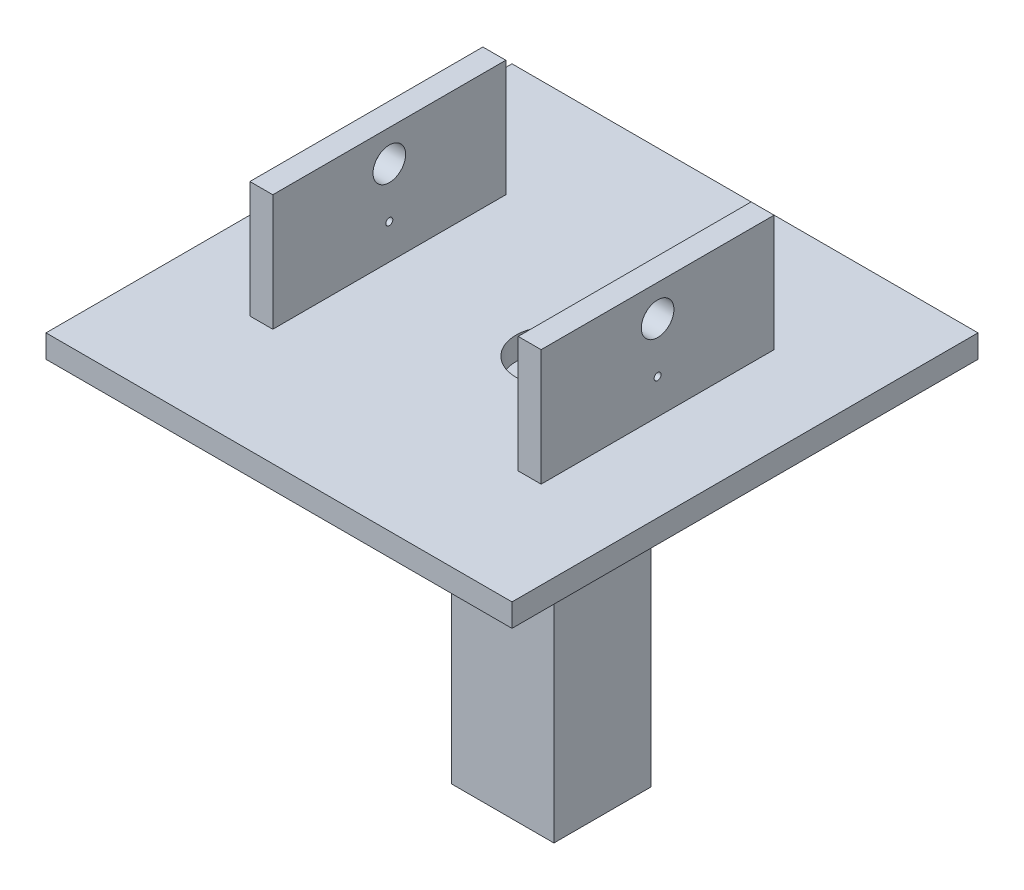
ISO-10303-21;
HEADER;
FILE_DESCRIPTION(('STEP AP214'),'2;1');
FILE_NAME('part.step','',(''),(''),'','','');
FILE_SCHEMA(('AUTOMOTIVE_DESIGN { 1 0 10303 214 1 1 1 1 }'));
ENDSEC;
DATA;
#1=APPLICATION_CONTEXT('core data for automotive mechanical design processes');
#2=APPLICATION_PROTOCOL_DEFINITION('international standard','automotive_design',2000,#1);
#3=PRODUCT_CONTEXT('',#1,'mechanical');
#4=PRODUCT('Part','Part','',(#3));
#5=PRODUCT_RELATED_PRODUCT_CATEGORY('part','',(#4));
#6=PRODUCT_DEFINITION_FORMATION('','',#4);
#7=PRODUCT_DEFINITION_CONTEXT('part definition',#1,'design');
#8=PRODUCT_DEFINITION('design','',#6,#7);
#9=PRODUCT_DEFINITION_SHAPE('','',#8);
#10=(LENGTH_UNIT() NAMED_UNIT(*) SI_UNIT(.MILLI.,.METRE.));
#11=(NAMED_UNIT(*) PLANE_ANGLE_UNIT() SI_UNIT($,.RADIAN.));
#12=(NAMED_UNIT(*) SI_UNIT($,.STERADIAN.) SOLID_ANGLE_UNIT());
#13=UNCERTAINTY_MEASURE_WITH_UNIT(LENGTH_MEASURE(1.E-05),#10,'distance_accuracy_value','');
#14=(GEOMETRIC_REPRESENTATION_CONTEXT(3) GLOBAL_UNCERTAINTY_ASSIGNED_CONTEXT((#13)) GLOBAL_UNIT_ASSIGNED_CONTEXT((#10,
#11,#12)) REPRESENTATION_CONTEXT('',''));
#15=CARTESIAN_POINT('',(0.,0.,0.));
#16=DIRECTION('',(0.,0.,1.));
#17=DIRECTION('',(1.,0.,0.));
#18=AXIS2_PLACEMENT_3D('',#15,#16,#17);
#19=CARTESIAN_POINT('',(0.,0.,0.));
#20=DIRECTION('',(0.,1.,0.));
#21=DIRECTION('',(0.,0.,1.));
#22=AXIS2_PLACEMENT_3D('',#19,#20,#21);
#23=PLANE('',#22);
#24=DIRECTION('',(0.,0.,1.));
#25=VECTOR('',#24,1.);
#26=CARTESIAN_POINT('',(0.,0.,0.));
#27=LINE('',#26,#25);
#28=CARTESIAN_POINT('',(0.,0.,0.));
#29=VERTEX_POINT('',#28);
#30=CARTESIAN_POINT('',(0.,0.,101.6));
#31=VERTEX_POINT('',#30);
#32=EDGE_CURVE('E308',#29,#31,#27,.T.);
#33=ORIENTED_EDGE('',*,*,#32,.F.);
#34=DIRECTION('',(-1.,0.,0.));
#35=VECTOR('',#34,1.);
#36=CARTESIAN_POINT('',(0.,0.,0.));
#37=LINE('',#36,#35);
#38=CARTESIAN_POINT('',(101.6,0.,0.));
#39=VERTEX_POINT('',#38);
#40=EDGE_CURVE('E314',#39,#29,#37,.T.);
#41=ORIENTED_EDGE('',*,*,#40,.F.);
#42=DIRECTION('',(0.,0.,-1.));
#43=VECTOR('',#42,1.);
#44=CARTESIAN_POINT('',(101.6,0.,0.));
#45=LINE('',#44,#43);
#46=CARTESIAN_POINT('',(101.6,0.,101.6));
#47=VERTEX_POINT('',#46);
#48=EDGE_CURVE('E330',#47,#39,#45,.T.);
#49=ORIENTED_EDGE('',*,*,#48,.F.);
#50=DIRECTION('',(1.,0.,0.));
#51=VECTOR('',#50,1.);
#52=CARTESIAN_POINT('',(0.,0.,101.6));
#53=LINE('',#52,#51);
#54=EDGE_CURVE('E327',#31,#47,#53,.T.);
#55=ORIENTED_EDGE('',*,*,#54,.F.);
#56=EDGE_LOOP('',(#33,#41,#49,#55));
#57=FACE_BOUND('',#56,.T.);
#58=DIRECTION('',(0.,0.,-1.));
#59=VECTOR('',#58,1.);
#60=CARTESIAN_POINT('',(48.1494249392775,0.,61.3607169010717));
#61=LINE('',#60,#59);
#62=CARTESIAN_POINT('',(48.1494249392775,0.,61.3607169010717));
#63=VERTEX_POINT('',#62);
#64=CARTESIAN_POINT('',(48.1494249392775,0.,40.1623354641884));
#65=VERTEX_POINT('',#64);
#66=EDGE_CURVE('E182',#63,#65,#61,.T.);
#67=ORIENTED_EDGE('',*,*,#66,.F.);
#68=DIRECTION('',(-1.,0.,0.));
#69=VECTOR('',#68,1.);
#70=CARTESIAN_POINT('',(48.1494249392775,0.,61.3607169010717));
#71=LINE('',#70,#69);
#72=CARTESIAN_POINT('',(70.4998923238175,0.,61.3607169010717));
#73=VERTEX_POINT('',#72);
#74=EDGE_CURVE('E179',#73,#63,#71,.T.);
#75=ORIENTED_EDGE('',*,*,#74,.F.);
#76=DIRECTION('',(0.,0.,1.));
#77=VECTOR('',#76,1.);
#78=CARTESIAN_POINT('',(70.4998923238175,0.,61.3607169010717));
#79=LINE('',#78,#77);
#80=CARTESIAN_POINT('',(70.4998923238175,0.,40.1623354641884));
#81=VERTEX_POINT('',#80);
#82=EDGE_CURVE('E67',#81,#73,#79,.T.);
#83=ORIENTED_EDGE('',*,*,#82,.F.);
#84=DIRECTION('',(1.,0.,0.));
#85=VECTOR('',#84,1.);
#86=CARTESIAN_POINT('',(48.1494249392775,0.,40.1623354641884));
#87=LINE('',#86,#85);
#88=EDGE_CURVE('E62',#65,#81,#87,.T.);
#89=ORIENTED_EDGE('',*,*,#88,.F.);
#90=EDGE_LOOP('',(#67,#75,#83,#89));
#91=FACE_BOUND('',#90,.T.);
#92=ADVANCED_FACE('F45',(#57,#91),#23,.F.);
#93=CARTESIAN_POINT('',(0.,5.,0.));
#94=DIRECTION('',(0.,1.,0.));
#95=DIRECTION('',(0.,0.,1.));
#96=AXIS2_PLACEMENT_3D('',#93,#94,#95);
#97=PLANE('',#96);
#98=CARTESIAN_POINT('',(59.61,5.,50.8));
#99=DIRECTION('',(0.,1.,0.));
#100=DIRECTION('',(0.,0.,1.));
#101=AXIS2_PLACEMENT_3D('',#98,#99,#100);
#102=CIRCLE('',#101,7.95020000000003);
#103=CARTESIAN_POINT('',(59.61,5.,58.7502));
#104=VERTEX_POINT('',#103);
#105=EDGE_CURVE('E198',#104,#104,#102,.T.);
#106=ORIENTED_EDGE('',*,*,#105,.F.);
#107=EDGE_LOOP('',(#106));
#108=FACE_BOUND('',#107,.T.);
#109=DIRECTION('',(0.,0.,1.));
#110=VECTOR('',#109,1.);
#111=CARTESIAN_POINT('',(0.,5.,0.));
#112=LINE('',#111,#110);
#113=CARTESIAN_POINT('',(0.,5.,0.));
#114=VERTEX_POINT('',#113);
#115=CARTESIAN_POINT('',(0.,5.,101.6));
#116=VERTEX_POINT('',#115);
#117=EDGE_CURVE('E309',#114,#116,#112,.T.);
#118=ORIENTED_EDGE('',*,*,#117,.T.);
#119=DIRECTION('',(1.,0.,0.));
#120=VECTOR('',#119,1.);
#121=CARTESIAN_POINT('',(0.,5.,101.6));
#122=LINE('',#121,#120);
#123=CARTESIAN_POINT('',(101.6,5.,101.6));
#124=VERTEX_POINT('',#123);
#125=EDGE_CURVE('E313',#116,#124,#122,.T.);
#126=ORIENTED_EDGE('',*,*,#125,.T.);
#127=DIRECTION('',(0.,0.,-1.));
#128=VECTOR('',#127,1.);
#129=CARTESIAN_POINT('',(101.6,5.,0.));
#130=LINE('',#129,#128);
#131=CARTESIAN_POINT('',(101.6,5.,0.));
#132=VERTEX_POINT('',#131);
#133=EDGE_CURVE('E317',#124,#132,#130,.T.);
#134=ORIENTED_EDGE('',*,*,#133,.T.);
#135=DIRECTION('',(-1.,0.,0.));
#136=VECTOR('',#135,1.);
#137=CARTESIAN_POINT('',(0.,5.,0.));
#138=LINE('',#137,#136);
#139=EDGE_CURVE('E320',#132,#114,#138,.T.);
#140=ORIENTED_EDGE('',*,*,#139,.T.);
#141=EDGE_LOOP('',(#118,#126,#134,#140));
#142=FACE_BOUND('',#141,.T.);
#143=DIRECTION('',(1.,0.,0.));
#144=VECTOR('',#143,1.);
#145=CARTESIAN_POINT('',(19.05,5.,76.2));
#146=LINE('',#145,#144);
#147=CARTESIAN_POINT('',(19.05,5.,76.2));
#148=VERTEX_POINT('',#147);
#149=CARTESIAN_POINT('',(24.05,5.,76.2));
#150=VERTEX_POINT('',#149);
#151=EDGE_CURVE('E286',#148,#150,#146,.T.);
#152=ORIENTED_EDGE('',*,*,#151,.F.);
#153=DIRECTION('',(0.,0.,1.));
#154=VECTOR('',#153,1.);
#155=CARTESIAN_POINT('',(19.05,5.,25.4));
#156=LINE('',#155,#154);
#157=CARTESIAN_POINT('',(19.05,5.,25.4));
#158=VERTEX_POINT('',#157);
#159=EDGE_CURVE('E267',#158,#148,#156,.T.);
#160=ORIENTED_EDGE('',*,*,#159,.F.);
#161=DIRECTION('',(-1.,0.,0.));
#162=VECTOR('',#161,1.);
#163=CARTESIAN_POINT('',(19.05,5.,25.4));
#164=LINE('',#163,#162);
#165=CARTESIAN_POINT('',(24.05,5.,25.4));
#166=VERTEX_POINT('',#165);
#167=EDGE_CURVE('E273',#166,#158,#164,.T.);
#168=ORIENTED_EDGE('',*,*,#167,.F.);
#169=DIRECTION('',(0.,0.,-1.));
#170=VECTOR('',#169,1.);
#171=CARTESIAN_POINT('',(24.05,5.,25.4));
#172=LINE('',#171,#170);
#173=EDGE_CURVE('E289',#150,#166,#172,.T.);
#174=ORIENTED_EDGE('',*,*,#173,.F.);
#175=EDGE_LOOP('',(#152,#160,#168,#174));
#176=FACE_BOUND('',#175,.T.);
#177=DIRECTION('',(1.,0.,0.));
#178=VECTOR('',#177,1.);
#179=CARTESIAN_POINT('',(77.55,5.,76.2));
#180=LINE('',#179,#178);
#181=CARTESIAN_POINT('',(77.55,5.,76.2));
#182=VERTEX_POINT('',#181);
#183=CARTESIAN_POINT('',(82.55,5.,76.2));
#184=VERTEX_POINT('',#183);
#185=EDGE_CURVE('E245',#182,#184,#180,.T.);
#186=ORIENTED_EDGE('',*,*,#185,.F.);
#187=DIRECTION('',(0.,0.,1.));
#188=VECTOR('',#187,1.);
#189=CARTESIAN_POINT('',(77.55,5.,25.4));
#190=LINE('',#189,#188);
#191=CARTESIAN_POINT('',(77.55,5.,25.4));
#192=VERTEX_POINT('',#191);
#193=EDGE_CURVE('E226',#192,#182,#190,.T.);
#194=ORIENTED_EDGE('',*,*,#193,.F.);
#195=DIRECTION('',(-1.,0.,0.));
#196=VECTOR('',#195,1.);
#197=CARTESIAN_POINT('',(77.55,5.,25.4));
#198=LINE('',#197,#196);
#199=CARTESIAN_POINT('',(82.55,5.,25.4));
#200=VERTEX_POINT('',#199);
#201=EDGE_CURVE('E232',#200,#192,#198,.T.);
#202=ORIENTED_EDGE('',*,*,#201,.F.);
#203=DIRECTION('',(0.,0.,-1.));
#204=VECTOR('',#203,1.);
#205=CARTESIAN_POINT('',(82.55,5.,25.4));
#206=LINE('',#205,#204);
#207=EDGE_CURVE('E248',#184,#200,#206,.T.);
#208=ORIENTED_EDGE('',*,*,#207,.F.);
#209=EDGE_LOOP('',(#186,#194,#202,#208));
#210=FACE_BOUND('',#209,.T.);
#211=ADVANCED_FACE('F362',(#108,#142,#176,#210),#97,.T.);
#212=CARTESIAN_POINT('',(0.,5.,0.));
#213=DIRECTION('',(1.,0.,0.));
#214=DIRECTION('',(0.,0.,-1.));
#215=AXIS2_PLACEMENT_3D('',#212,#213,#214);
#216=PLANE('',#215);
#217=ORIENTED_EDGE('',*,*,#32,.T.);
#218=DIRECTION('',(0.,-1.,0.));
#219=VECTOR('',#218,1.);
#220=CARTESIAN_POINT('',(0.,5.,101.6));
#221=LINE('',#220,#219);
#222=EDGE_CURVE('E11',#116,#31,#221,.T.);
#223=ORIENTED_EDGE('',*,*,#222,.F.);
#224=ORIENTED_EDGE('',*,*,#117,.F.);
#225=DIRECTION('',(0.,-1.,0.));
#226=VECTOR('',#225,1.);
#227=CARTESIAN_POINT('',(0.,5.,0.));
#228=LINE('',#227,#226);
#229=EDGE_CURVE('E323',#114,#29,#228,.T.);
#230=ORIENTED_EDGE('',*,*,#229,.T.);
#231=EDGE_LOOP('',(#217,#223,#224,#230));
#232=FACE_BOUND('',#231,.T.);
#233=ADVANCED_FACE('F47',(#232),#216,.F.);
#234=CARTESIAN_POINT('',(0.,5.,101.6));
#235=DIRECTION('',(0.,0.,-1.));
#236=DIRECTION('',(-1.,0.,0.));
#237=AXIS2_PLACEMENT_3D('',#234,#235,#236);
#238=PLANE('',#237);
#239=ORIENTED_EDGE('',*,*,#54,.T.);
#240=DIRECTION('',(0.,-1.,0.));
#241=VECTOR('',#240,1.);
#242=CARTESIAN_POINT('',(101.6,5.,101.6));
#243=LINE('',#242,#241);
#244=EDGE_CURVE('E55',#124,#47,#243,.T.);
#245=ORIENTED_EDGE('',*,*,#244,.F.);
#246=ORIENTED_EDGE('',*,*,#125,.F.);
#247=ORIENTED_EDGE('',*,*,#222,.T.);
#248=EDGE_LOOP('',(#239,#245,#246,#247));
#249=FACE_BOUND('',#248,.T.);
#250=ADVANCED_FACE('F364',(#249),#238,.F.);
#251=CARTESIAN_POINT('',(101.6,5.,0.));
#252=DIRECTION('',(-1.,0.,0.));
#253=DIRECTION('',(0.,0.,1.));
#254=AXIS2_PLACEMENT_3D('',#251,#252,#253);
#255=PLANE('',#254);
#256=ORIENTED_EDGE('',*,*,#48,.T.);
#257=DIRECTION('',(0.,-1.,0.));
#258=VECTOR('',#257,1.);
#259=CARTESIAN_POINT('',(101.6,5.,0.));
#260=LINE('',#259,#258);
#261=EDGE_CURVE('E338',#132,#39,#260,.T.);
#262=ORIENTED_EDGE('',*,*,#261,.F.);
#263=ORIENTED_EDGE('',*,*,#133,.F.);
#264=ORIENTED_EDGE('',*,*,#244,.T.);
#265=EDGE_LOOP('',(#256,#262,#263,#264));
#266=FACE_BOUND('',#265,.T.);
#267=ADVANCED_FACE('F348',(#266),#255,.F.);
#268=CARTESIAN_POINT('',(0.,5.,0.));
#269=DIRECTION('',(0.,0.,1.));
#270=DIRECTION('',(1.,0.,0.));
#271=AXIS2_PLACEMENT_3D('',#268,#269,#270);
#272=PLANE('',#271);
#273=ORIENTED_EDGE('',*,*,#40,.T.);
#274=ORIENTED_EDGE('',*,*,#229,.F.);
#275=ORIENTED_EDGE('',*,*,#139,.F.);
#276=ORIENTED_EDGE('',*,*,#261,.T.);
#277=EDGE_LOOP('',(#273,#274,#275,#276));
#278=FACE_BOUND('',#277,.T.);
#279=ADVANCED_FACE('F356',(#278),#272,.F.);
#280=CARTESIAN_POINT('',(19.05,30.4,25.4));
#281=DIRECTION('',(1.,0.,0.));
#282=DIRECTION('',(0.,0.,-1.));
#283=AXIS2_PLACEMENT_3D('',#280,#281,#282);
#284=PLANE('',#283);
#285=CARTESIAN_POINT('',(19.05,12.62,50.8));
#286=DIRECTION('',(-1.,0.,0.));
#287=DIRECTION('',(0.,0.,1.));
#288=AXIS2_PLACEMENT_3D('',#285,#286,#287);
#289=CIRCLE('',#288,0.761999999999996);
#290=CARTESIAN_POINT('',(19.05,12.62,51.562));
#291=VERTEX_POINT('',#290);
#292=EDGE_CURVE('E184',#291,#291,#289,.T.);
#293=ORIENTED_EDGE('',*,*,#292,.F.);
#294=EDGE_LOOP('',(#293));
#295=FACE_BOUND('',#294,.T.);
#296=CARTESIAN_POINT('',(19.05,23.542,50.8));
#297=DIRECTION('',(-1.,0.,0.));
#298=DIRECTION('',(0.,0.,1.));
#299=AXIS2_PLACEMENT_3D('',#296,#297,#298);
#300=CIRCLE('',#299,3.55600000000001);
#301=CARTESIAN_POINT('',(19.05,23.542,54.356));
#302=VERTEX_POINT('',#301);
#303=EDGE_CURVE('E214',#302,#302,#300,.T.);
#304=ORIENTED_EDGE('',*,*,#303,.F.);
#305=EDGE_LOOP('',(#304));
#306=FACE_BOUND('',#305,.T.);
#307=ORIENTED_EDGE('',*,*,#159,.T.);
#308=DIRECTION('',(0.,-1.,0.));
#309=VECTOR('',#308,1.);
#310=CARTESIAN_POINT('',(19.05,30.4,76.2));
#311=LINE('',#310,#309);
#312=CARTESIAN_POINT('',(19.05,30.4,76.2));
#313=VERTEX_POINT('',#312);
#314=EDGE_CURVE('E305',#313,#148,#311,.T.);
#315=ORIENTED_EDGE('',*,*,#314,.F.);
#316=DIRECTION('',(0.,0.,1.));
#317=VECTOR('',#316,1.);
#318=CARTESIAN_POINT('',(19.05,30.4,25.4));
#319=LINE('',#318,#317);
#320=CARTESIAN_POINT('',(19.05,30.4,25.4));
#321=VERTEX_POINT('',#320);
#322=EDGE_CURVE('E268',#321,#313,#319,.T.);
#323=ORIENTED_EDGE('',*,*,#322,.F.);
#324=DIRECTION('',(0.,-1.,0.));
#325=VECTOR('',#324,1.);
#326=CARTESIAN_POINT('',(19.05,30.4,25.4));
#327=LINE('',#326,#325);
#328=EDGE_CURVE('E282',#321,#158,#327,.T.);
#329=ORIENTED_EDGE('',*,*,#328,.T.);
#330=EDGE_LOOP('',(#307,#315,#323,#329));
#331=FACE_BOUND('',#330,.T.);
#332=ADVANCED_FACE('F383',(#295,#306,#331),#284,.F.);
#333=CARTESIAN_POINT('',(19.05,30.4,76.2));
#334=DIRECTION('',(0.,0.,-1.));
#335=DIRECTION('',(-1.,0.,0.));
#336=AXIS2_PLACEMENT_3D('',#333,#334,#335);
#337=PLANE('',#336);
#338=ORIENTED_EDGE('',*,*,#151,.T.);
#339=DIRECTION('',(0.,-1.,0.));
#340=VECTOR('',#339,1.);
#341=CARTESIAN_POINT('',(24.05,30.4,76.2));
#342=LINE('',#341,#340);
#343=CARTESIAN_POINT('',(24.05,30.4,76.2));
#344=VERTEX_POINT('',#343);
#345=EDGE_CURVE('E301',#344,#150,#342,.T.);
#346=ORIENTED_EDGE('',*,*,#345,.F.);
#347=DIRECTION('',(1.,0.,0.));
#348=VECTOR('',#347,1.);
#349=CARTESIAN_POINT('',(19.05,30.4,76.2));
#350=LINE('',#349,#348);
#351=EDGE_CURVE('E272',#313,#344,#350,.T.);
#352=ORIENTED_EDGE('',*,*,#351,.F.);
#353=ORIENTED_EDGE('',*,*,#314,.T.);
#354=EDGE_LOOP('',(#338,#346,#352,#353));
#355=FACE_BOUND('',#354,.T.);
#356=ADVANCED_FACE('F388',(#355),#337,.F.);
#357=CARTESIAN_POINT('',(24.05,30.4,25.4));
#358=DIRECTION('',(-1.,0.,0.));
#359=DIRECTION('',(0.,0.,1.));
#360=AXIS2_PLACEMENT_3D('',#357,#358,#359);
#361=PLANE('',#360);
#362=CARTESIAN_POINT('',(24.05,12.62,50.8));
#363=DIRECTION('',(-1.,0.,0.));
#364=DIRECTION('',(0.,0.,1.));
#365=AXIS2_PLACEMENT_3D('',#362,#363,#364);
#366=CIRCLE('',#365,0.761999999999996);
#367=CARTESIAN_POINT('',(24.05,12.62,51.562));
#368=VERTEX_POINT('',#367);
#369=EDGE_CURVE('E189',#368,#368,#366,.F.);
#370=ORIENTED_EDGE('',*,*,#369,.F.);
#371=EDGE_LOOP('',(#370));
#372=FACE_BOUND('',#371,.T.);
#373=CARTESIAN_POINT('',(24.05,23.542,50.8));
#374=DIRECTION('',(-1.,0.,0.));
#375=DIRECTION('',(0.,0.,1.));
#376=AXIS2_PLACEMENT_3D('',#373,#374,#375);
#377=CIRCLE('',#376,3.55600000000001);
#378=CARTESIAN_POINT('',(24.05,23.542,54.356));
#379=VERTEX_POINT('',#378);
#380=EDGE_CURVE('E222',#379,#379,#377,.T.);
#381=ORIENTED_EDGE('',*,*,#380,.T.);
#382=EDGE_LOOP('',(#381));
#383=FACE_BOUND('',#382,.T.);
#384=ORIENTED_EDGE('',*,*,#173,.T.);
#385=DIRECTION('',(0.,-1.,0.));
#386=VECTOR('',#385,1.);
#387=CARTESIAN_POINT('',(24.05,30.4,25.4));
#388=LINE('',#387,#386);
#389=CARTESIAN_POINT('',(24.05,30.4,25.4));
#390=VERTEX_POINT('',#389);
#391=EDGE_CURVE('E298',#390,#166,#388,.T.);
#392=ORIENTED_EDGE('',*,*,#391,.F.);
#393=DIRECTION('',(0.,0.,-1.));
#394=VECTOR('',#393,1.);
#395=CARTESIAN_POINT('',(24.05,30.4,25.4));
#396=LINE('',#395,#394);
#397=EDGE_CURVE('E276',#344,#390,#396,.T.);
#398=ORIENTED_EDGE('',*,*,#397,.F.);
#399=ORIENTED_EDGE('',*,*,#345,.T.);
#400=EDGE_LOOP('',(#384,#392,#398,#399));
#401=FACE_BOUND('',#400,.T.);
#402=ADVANCED_FACE('F394',(#372,#383,#401),#361,.F.);
#403=CARTESIAN_POINT('',(19.05,30.4,25.4));
#404=DIRECTION('',(0.,0.,1.));
#405=DIRECTION('',(1.,0.,0.));
#406=AXIS2_PLACEMENT_3D('',#403,#404,#405);
#407=PLANE('',#406);
#408=ORIENTED_EDGE('',*,*,#167,.T.);
#409=ORIENTED_EDGE('',*,*,#328,.F.);
#410=DIRECTION('',(-1.,0.,0.));
#411=VECTOR('',#410,1.);
#412=CARTESIAN_POINT('',(19.05,30.4,25.4));
#413=LINE('',#412,#411);
#414=EDGE_CURVE('E279',#390,#321,#413,.T.);
#415=ORIENTED_EDGE('',*,*,#414,.F.);
#416=ORIENTED_EDGE('',*,*,#391,.T.);
#417=EDGE_LOOP('',(#408,#409,#415,#416));
#418=FACE_BOUND('',#417,.T.);
#419=ADVANCED_FACE('F401',(#418),#407,.F.);
#420=CARTESIAN_POINT('',(0.,30.4,0.));
#421=DIRECTION('',(0.,1.,0.));
#422=DIRECTION('',(0.,0.,1.));
#423=AXIS2_PLACEMENT_3D('',#420,#421,#422);
#424=PLANE('',#423);
#425=ORIENTED_EDGE('',*,*,#322,.T.);
#426=ORIENTED_EDGE('',*,*,#351,.T.);
#427=ORIENTED_EDGE('',*,*,#397,.T.);
#428=ORIENTED_EDGE('',*,*,#414,.T.);
#429=EDGE_LOOP('',(#425,#426,#427,#428));
#430=FACE_BOUND('',#429,.T.);
#431=ADVANCED_FACE('F405',(#430),#424,.T.);
#432=CARTESIAN_POINT('',(77.55,30.4,25.4));
#433=DIRECTION('',(1.,0.,0.));
#434=DIRECTION('',(0.,0.,-1.));
#435=AXIS2_PLACEMENT_3D('',#432,#433,#434);
#436=PLANE('',#435);
#437=CARTESIAN_POINT('',(77.55,12.62,50.8));
#438=DIRECTION('',(1.,0.,0.));
#439=DIRECTION('',(0.,0.,-1.));
#440=AXIS2_PLACEMENT_3D('',#437,#438,#439);
#441=CIRCLE('',#440,0.761999999999996);
#442=CARTESIAN_POINT('',(77.55,12.62,50.038));
#443=VERTEX_POINT('',#442);
#444=EDGE_CURVE('E203',#443,#443,#441,.F.);
#445=ORIENTED_EDGE('',*,*,#444,.F.);
#446=EDGE_LOOP('',(#445));
#447=FACE_BOUND('',#446,.T.);
#448=CARTESIAN_POINT('',(77.55,23.542,50.8));
#449=DIRECTION('',(1.,0.,0.));
#450=DIRECTION('',(0.,0.,-1.));
#451=AXIS2_PLACEMENT_3D('',#448,#449,#450);
#452=CIRCLE('',#451,3.55600000000001);
#453=CARTESIAN_POINT('',(77.55,23.542,47.244));
#454=VERTEX_POINT('',#453);
#455=EDGE_CURVE('E218',#454,#454,#452,.T.);
#456=ORIENTED_EDGE('',*,*,#455,.T.);
#457=EDGE_LOOP('',(#456));
#458=FACE_BOUND('',#457,.T.);
#459=ORIENTED_EDGE('',*,*,#193,.T.);
#460=DIRECTION('',(0.,-1.,0.));
#461=VECTOR('',#460,1.);
#462=CARTESIAN_POINT('',(77.55,30.4,76.2));
#463=LINE('',#462,#461);
#464=CARTESIAN_POINT('',(77.55,30.4,76.2));
#465=VERTEX_POINT('',#464);
#466=EDGE_CURVE('E264',#465,#182,#463,.T.);
#467=ORIENTED_EDGE('',*,*,#466,.F.);
#468=DIRECTION('',(0.,0.,1.));
#469=VECTOR('',#468,1.);
#470=CARTESIAN_POINT('',(77.55,30.4,25.4));
#471=LINE('',#470,#469);
#472=CARTESIAN_POINT('',(77.55,30.4,25.4));
#473=VERTEX_POINT('',#472);
#474=EDGE_CURVE('E227',#473,#465,#471,.T.);
#475=ORIENTED_EDGE('',*,*,#474,.F.);
#476=DIRECTION('',(0.,-1.,0.));
#477=VECTOR('',#476,1.);
#478=CARTESIAN_POINT('',(77.55,30.4,25.4));
#479=LINE('',#478,#477);
#480=EDGE_CURVE('E241',#473,#192,#479,.T.);
#481=ORIENTED_EDGE('',*,*,#480,.T.);
#482=EDGE_LOOP('',(#459,#467,#475,#481));
#483=FACE_BOUND('',#482,.T.);
#484=ADVANCED_FACE('F409',(#447,#458,#483),#436,.F.);
#485=CARTESIAN_POINT('',(77.55,30.4,76.2));
#486=DIRECTION('',(0.,0.,-1.));
#487=DIRECTION('',(-1.,0.,0.));
#488=AXIS2_PLACEMENT_3D('',#485,#486,#487);
#489=PLANE('',#488);
#490=ORIENTED_EDGE('',*,*,#185,.T.);
#491=DIRECTION('',(0.,-1.,0.));
#492=VECTOR('',#491,1.);
#493=CARTESIAN_POINT('',(82.55,30.4,76.2));
#494=LINE('',#493,#492);
#495=CARTESIAN_POINT('',(82.55,30.4,76.2));
#496=VERTEX_POINT('',#495);
#497=EDGE_CURVE('E260',#496,#184,#494,.T.);
#498=ORIENTED_EDGE('',*,*,#497,.F.);
#499=DIRECTION('',(1.,0.,0.));
#500=VECTOR('',#499,1.);
#501=CARTESIAN_POINT('',(77.55,30.4,76.2));
#502=LINE('',#501,#500);
#503=EDGE_CURVE('E231',#465,#496,#502,.T.);
#504=ORIENTED_EDGE('',*,*,#503,.F.);
#505=ORIENTED_EDGE('',*,*,#466,.T.);
#506=EDGE_LOOP('',(#490,#498,#504,#505));
#507=FACE_BOUND('',#506,.T.);
#508=ADVANCED_FACE('F413',(#507),#489,.F.);
#509=CARTESIAN_POINT('',(82.55,30.4,25.4));
#510=DIRECTION('',(-1.,0.,0.));
#511=DIRECTION('',(0.,0.,1.));
#512=AXIS2_PLACEMENT_3D('',#509,#510,#511);
#513=PLANE('',#512);
#514=CARTESIAN_POINT('',(82.55,12.62,50.8));
#515=DIRECTION('',(1.,0.,0.));
#516=DIRECTION('',(0.,0.,-1.));
#517=AXIS2_PLACEMENT_3D('',#514,#515,#516);
#518=CIRCLE('',#517,0.761999999999996);
#519=CARTESIAN_POINT('',(82.55,12.62,50.038));
#520=VERTEX_POINT('',#519);
#521=EDGE_CURVE('E210',#520,#520,#518,.T.);
#522=ORIENTED_EDGE('',*,*,#521,.F.);
#523=EDGE_LOOP('',(#522));
#524=FACE_BOUND('',#523,.T.);
#525=CARTESIAN_POINT('',(82.55,23.542,50.8));
#526=DIRECTION('',(-1.,0.,0.));
#527=DIRECTION('',(0.,0.,1.));
#528=AXIS2_PLACEMENT_3D('',#525,#526,#527);
#529=CIRCLE('',#528,3.55600000000001);
#530=CARTESIAN_POINT('',(82.55,23.542,54.356));
#531=VERTEX_POINT('',#530);
#532=EDGE_CURVE('E49',#531,#531,#529,.T.);
#533=ORIENTED_EDGE('',*,*,#532,.T.);
#534=EDGE_LOOP('',(#533));
#535=FACE_BOUND('',#534,.T.);
#536=ORIENTED_EDGE('',*,*,#207,.T.);
#537=DIRECTION('',(0.,-1.,0.));
#538=VECTOR('',#537,1.);
#539=CARTESIAN_POINT('',(82.55,30.4,25.4));
#540=LINE('',#539,#538);
#541=CARTESIAN_POINT('',(82.55,30.4,25.4));
#542=VERTEX_POINT('',#541);
#543=EDGE_CURVE('E257',#542,#200,#540,.T.);
#544=ORIENTED_EDGE('',*,*,#543,.F.);
#545=DIRECTION('',(0.,0.,-1.));
#546=VECTOR('',#545,1.);
#547=CARTESIAN_POINT('',(82.55,30.4,25.4));
#548=LINE('',#547,#546);
#549=EDGE_CURVE('E235',#496,#542,#548,.T.);
#550=ORIENTED_EDGE('',*,*,#549,.F.);
#551=ORIENTED_EDGE('',*,*,#497,.T.);
#552=EDGE_LOOP('',(#536,#544,#550,#551));
#553=FACE_BOUND('',#552,.T.);
#554=ADVANCED_FACE('F417',(#524,#535,#553),#513,.F.);
#555=CARTESIAN_POINT('',(77.55,30.4,25.4));
#556=DIRECTION('',(0.,0.,1.));
#557=DIRECTION('',(1.,0.,0.));
#558=AXIS2_PLACEMENT_3D('',#555,#556,#557);
#559=PLANE('',#558);
#560=ORIENTED_EDGE('',*,*,#201,.T.);
#561=ORIENTED_EDGE('',*,*,#480,.F.);
#562=DIRECTION('',(-1.,0.,0.));
#563=VECTOR('',#562,1.);
#564=CARTESIAN_POINT('',(77.55,30.4,25.4));
#565=LINE('',#564,#563);
#566=EDGE_CURVE('E238',#542,#473,#565,.T.);
#567=ORIENTED_EDGE('',*,*,#566,.F.);
#568=ORIENTED_EDGE('',*,*,#543,.T.);
#569=EDGE_LOOP('',(#560,#561,#567,#568));
#570=FACE_BOUND('',#569,.T.);
#571=ADVANCED_FACE('F421',(#570),#559,.F.);
#572=CARTESIAN_POINT('',(0.,30.4,0.));
#573=DIRECTION('',(0.,1.,0.));
#574=DIRECTION('',(0.,0.,1.));
#575=AXIS2_PLACEMENT_3D('',#572,#573,#574);
#576=PLANE('',#575);
#577=ORIENTED_EDGE('',*,*,#474,.T.);
#578=ORIENTED_EDGE('',*,*,#503,.T.);
#579=ORIENTED_EDGE('',*,*,#549,.T.);
#580=ORIENTED_EDGE('',*,*,#566,.T.);
#581=EDGE_LOOP('',(#577,#578,#579,#580));
#582=FACE_BOUND('',#581,.T.);
#583=ADVANCED_FACE('F425',(#582),#576,.T.);
#584=CARTESIAN_POINT('',(101.6,23.542,50.8));
#585=DIRECTION('',(-1.,0.,0.));
#586=DIRECTION('',(0.,0.,1.));
#587=AXIS2_PLACEMENT_3D('',#584,#585,#586);
#588=CYLINDRICAL_SURFACE('',#587,3.55600000000001);
#589=ORIENTED_EDGE('',*,*,#532,.F.);
#590=EDGE_LOOP('',(#589));
#591=FACE_BOUND('',#590,.T.);
#592=ORIENTED_EDGE('',*,*,#455,.F.);
#593=EDGE_LOOP('',(#592));
#594=FACE_BOUND('',#593,.T.);
#595=ADVANCED_FACE('F429',(#591,#594),#588,.F.);
#596=ORIENTED_EDGE('',*,*,#303,.T.);
#597=EDGE_LOOP('',(#596));
#598=FACE_BOUND('',#597,.T.);
#599=ORIENTED_EDGE('',*,*,#380,.F.);
#600=EDGE_LOOP('',(#599));
#601=FACE_BOUND('',#600,.T.);
#602=ADVANCED_FACE('F431',(#598,#601),#588,.F.);
#603=CARTESIAN_POINT('',(-0.001000000000001,12.62,50.8));
#604=DIRECTION('',(1.,0.,0.));
#605=DIRECTION('',(0.,0.,-1.));
#606=AXIS2_PLACEMENT_3D('',#603,#604,#605);
#607=CYLINDRICAL_SURFACE('',#606,0.761999999999996);
#608=CARTESIAN_POINT('',(82.55,12.62,50.038));
#609=CARTESIAN_POINT('',(82.4979166666667,12.62,50.038));
#610=CARTESIAN_POINT('',(82.4458333333333,12.62,50.038));
#611=CARTESIAN_POINT('',(82.3416666666667,12.62,50.038));
#612=CARTESIAN_POINT('',(82.2895833333333,12.62,50.038));
#613=CARTESIAN_POINT('',(82.1854166666667,12.62,50.038));
#614=CARTESIAN_POINT('',(82.1333333333333,12.62,50.038));
#615=CARTESIAN_POINT('',(82.0291666666667,12.62,50.038));
#616=CARTESIAN_POINT('',(81.9770833333333,12.62,50.038));
#617=CARTESIAN_POINT('',(81.8729166666667,12.62,50.038));
#618=CARTESIAN_POINT('',(81.8208333333333,12.62,50.038));
#619=CARTESIAN_POINT('',(81.7166666666667,12.62,50.038));
#620=CARTESIAN_POINT('',(81.6645833333333,12.62,50.038));
#621=CARTESIAN_POINT('',(81.5604166666667,12.62,50.038));
#622=CARTESIAN_POINT('',(81.5083333333333,12.62,50.038));
#623=CARTESIAN_POINT('',(81.4041666666667,12.62,50.038));
#624=CARTESIAN_POINT('',(81.3520833333333,12.62,50.038));
#625=CARTESIAN_POINT('',(81.2479166666667,12.62,50.038));
#626=CARTESIAN_POINT('',(81.1958333333333,12.62,50.038));
#627=CARTESIAN_POINT('',(81.0916666666667,12.62,50.038));
#628=CARTESIAN_POINT('',(81.0395833333333,12.62,50.038));
#629=CARTESIAN_POINT('',(80.9354166666667,12.62,50.038));
#630=CARTESIAN_POINT('',(80.8833333333333,12.62,50.038));
#631=CARTESIAN_POINT('',(80.7791666666667,12.62,50.038));
#632=CARTESIAN_POINT('',(80.7270833333333,12.62,50.038));
#633=CARTESIAN_POINT('',(80.6229166666667,12.62,50.038));
#634=CARTESIAN_POINT('',(80.5708333333333,12.62,50.038));
#635=CARTESIAN_POINT('',(80.4666666666667,12.62,50.038));
#636=CARTESIAN_POINT('',(80.4145833333333,12.62,50.038));
#637=CARTESIAN_POINT('',(80.3104166666667,12.62,50.038));
#638=CARTESIAN_POINT('',(80.2583333333333,12.62,50.038));
#639=CARTESIAN_POINT('',(80.1541666666667,12.62,50.038));
#640=CARTESIAN_POINT('',(80.1020833333333,12.62,50.038));
#641=CARTESIAN_POINT('',(79.9979166666667,12.62,50.038));
#642=CARTESIAN_POINT('',(79.9458333333333,12.62,50.038));
#643=CARTESIAN_POINT('',(79.8416666666667,12.62,50.038));
#644=CARTESIAN_POINT('',(79.7895833333333,12.62,50.038));
#645=CARTESIAN_POINT('',(79.6854166666667,12.62,50.038));
#646=CARTESIAN_POINT('',(79.6333333333333,12.62,50.038));
#647=CARTESIAN_POINT('',(79.5291666666667,12.62,50.038));
#648=CARTESIAN_POINT('',(79.4770833333333,12.62,50.038));
#649=CARTESIAN_POINT('',(79.3729166666667,12.62,50.038));
#650=CARTESIAN_POINT('',(79.3208333333333,12.62,50.038));
#651=CARTESIAN_POINT('',(79.2166666666667,12.62,50.038));
#652=CARTESIAN_POINT('',(79.1645833333333,12.62,50.038));
#653=CARTESIAN_POINT('',(79.0604166666667,12.62,50.038));
#654=CARTESIAN_POINT('',(79.0083333333333,12.62,50.038));
#655=CARTESIAN_POINT('',(78.9041666666667,12.62,50.038));
#656=CARTESIAN_POINT('',(78.8520833333333,12.62,50.038));
#657=CARTESIAN_POINT('',(78.7479166666667,12.62,50.038));
#658=CARTESIAN_POINT('',(78.6958333333333,12.62,50.038));
#659=CARTESIAN_POINT('',(78.5916666666667,12.62,50.038));
#660=CARTESIAN_POINT('',(78.5395833333333,12.62,50.038));
#661=CARTESIAN_POINT('',(78.4354166666667,12.62,50.038));
#662=CARTESIAN_POINT('',(78.3833333333333,12.62,50.038));
#663=CARTESIAN_POINT('',(78.2791666666667,12.62,50.038));
#664=CARTESIAN_POINT('',(78.2270833333333,12.62,50.038));
#665=CARTESIAN_POINT('',(78.1229166666667,12.62,50.038));
#666=CARTESIAN_POINT('',(78.0708333333333,12.62,50.038));
#667=CARTESIAN_POINT('',(77.9666666666667,12.62,50.038));
#668=CARTESIAN_POINT('',(77.9145833333333,12.62,50.038));
#669=CARTESIAN_POINT('',(77.8104166666667,12.62,50.038));
#670=CARTESIAN_POINT('',(77.7583333333333,12.62,50.038));
#671=CARTESIAN_POINT('',(77.6541666666667,12.62,50.038));
#672=CARTESIAN_POINT('',(77.6020833333333,12.62,50.038));
#673=CARTESIAN_POINT('',(77.55,12.62,50.038));
#674=B_SPLINE_CURVE_WITH_KNOTS('',3,(#608,#609,#610,#611,#612,#613,#614,#615,#616,#617,#618,
#619,#620,#621,#622,#623,#624,#625,#626,#627,#628,#629,#630,#631,#632,#633,#634,#635,#636,#637,
#638,#639,#640,#641,#642,#643,#644,#645,#646,#647,#648,#649,#650,#651,#652,#653,#654,#655,#656,
#657,#658,#659,#660,#661,#662,#663,#664,#665,#666,#667,#668,#669,#670,#671,#672,#673),
.UNSPECIFIED.,.F.,.F.,(4,2,2,2,2,2,2,2,2,2,2,2,2,2,2,2,2,2,2,2,2,2,2,2,2,2,2,2,2,2,2,2,4),(0.,
0.156249999999997,0.312499999999993,0.468750000000004,0.625000000000001,0.781249999999997,
0.937500000000008,1.09375,1.25,1.40625,1.56249999999999,1.71875,1.875,2.03125,2.18750000000001,
2.34375000000001,2.5,2.65625,2.8125,2.96875000000001,3.125,3.28125,3.43750000000001,
3.59375000000001,3.75,3.90625,4.0625,4.21875000000001,4.375,4.53125,4.68750000000001,
4.84375000000001,5.),.UNSPECIFIED.);
#675=EDGE_CURVE('BSEAM434',#520,#443,#674,.T.);
#676=ORIENTED_EDGE('',*,*,#521,.T.);
#677=ORIENTED_EDGE('',*,*,#444,.T.);
#678=ORIENTED_EDGE('',*,*,#675,.T.);
#679=ORIENTED_EDGE('',*,*,#675,.F.);
#680=EDGE_LOOP('',(#676,#678,#677,#679));
#681=FACE_BOUND('',#680,.T.);
#682=ADVANCED_FACE('F434',(#681),#607,.F.);
#683=CARTESIAN_POINT('',(59.61,0.,50.8));
#684=DIRECTION('',(0.,1.,0.));
#685=DIRECTION('',(0.,0.,1.));
#686=AXIS2_PLACEMENT_3D('',#683,#684,#685);
#687=CYLINDRICAL_SURFACE('',#686,7.95020000000003);
#688=CARTESIAN_POINT('',(59.61,0.,50.8));
#689=DIRECTION('',(0.,1.,0.));
#690=DIRECTION('',(0.,0.,1.));
#691=AXIS2_PLACEMENT_3D('',#688,#689,#690);
#692=CIRCLE('',#691,7.95020000000003);
#693=CARTESIAN_POINT('',(59.61,0.,58.7502));
#694=VERTEX_POINT('',#693);
#695=EDGE_CURVE('E199',#694,#694,#692,.T.);
#696=ORIENTED_EDGE('',*,*,#695,.F.);
#697=EDGE_LOOP('',(#696));
#698=FACE_BOUND('',#697,.T.);
#699=ORIENTED_EDGE('',*,*,#105,.T.);
#700=EDGE_LOOP('',(#699));
#701=FACE_BOUND('',#700,.T.);
#702=ADVANCED_FACE('F438',(#698,#701),#687,.F.);
#703=CARTESIAN_POINT('',(101.601,12.62,50.8));
#704=DIRECTION('',(-1.,0.,0.));
#705=DIRECTION('',(0.,0.,1.));
#706=AXIS2_PLACEMENT_3D('',#703,#704,#705);
#707=CYLINDRICAL_SURFACE('',#706,0.761999999999996);
#708=CARTESIAN_POINT('',(19.05,12.62,51.562));
#709=CARTESIAN_POINT('',(19.1020833333333,12.62,51.562));
#710=CARTESIAN_POINT('',(19.1541666666667,12.62,51.562));
#711=CARTESIAN_POINT('',(19.2583333333333,12.62,51.562));
#712=CARTESIAN_POINT('',(19.3104166666667,12.62,51.562));
#713=CARTESIAN_POINT('',(19.4145833333333,12.62,51.562));
#714=CARTESIAN_POINT('',(19.4666666666667,12.62,51.562));
#715=CARTESIAN_POINT('',(19.5708333333333,12.62,51.562));
#716=CARTESIAN_POINT('',(19.6229166666667,12.62,51.562));
#717=CARTESIAN_POINT('',(19.7270833333333,12.62,51.562));
#718=CARTESIAN_POINT('',(19.7791666666667,12.62,51.562));
#719=CARTESIAN_POINT('',(19.8833333333333,12.62,51.562));
#720=CARTESIAN_POINT('',(19.9354166666667,12.62,51.562));
#721=CARTESIAN_POINT('',(20.0395833333333,12.62,51.562));
#722=CARTESIAN_POINT('',(20.0916666666667,12.62,51.562));
#723=CARTESIAN_POINT('',(20.1958333333333,12.62,51.562));
#724=CARTESIAN_POINT('',(20.2479166666667,12.62,51.562));
#725=CARTESIAN_POINT('',(20.3520833333333,12.62,51.562));
#726=CARTESIAN_POINT('',(20.4041666666667,12.62,51.562));
#727=CARTESIAN_POINT('',(20.5083333333333,12.62,51.562));
#728=CARTESIAN_POINT('',(20.5604166666667,12.62,51.562));
#729=CARTESIAN_POINT('',(20.6645833333333,12.62,51.562));
#730=CARTESIAN_POINT('',(20.7166666666667,12.62,51.562));
#731=CARTESIAN_POINT('',(20.8208333333333,12.62,51.562));
#732=CARTESIAN_POINT('',(20.8729166666667,12.62,51.562));
#733=CARTESIAN_POINT('',(20.9770833333333,12.62,51.562));
#734=CARTESIAN_POINT('',(21.0291666666667,12.62,51.562));
#735=CARTESIAN_POINT('',(21.1333333333333,12.62,51.562));
#736=CARTESIAN_POINT('',(21.1854166666667,12.62,51.562));
#737=CARTESIAN_POINT('',(21.2895833333333,12.62,51.562));
#738=CARTESIAN_POINT('',(21.3416666666667,12.62,51.562));
#739=CARTESIAN_POINT('',(21.4458333333333,12.62,51.562));
#740=CARTESIAN_POINT('',(21.4979166666667,12.62,51.562));
#741=CARTESIAN_POINT('',(21.6020833333333,12.62,51.562));
#742=CARTESIAN_POINT('',(21.6541666666667,12.62,51.562));
#743=CARTESIAN_POINT('',(21.7583333333333,12.62,51.562));
#744=CARTESIAN_POINT('',(21.8104166666667,12.62,51.562));
#745=CARTESIAN_POINT('',(21.9145833333333,12.62,51.562));
#746=CARTESIAN_POINT('',(21.9666666666667,12.62,51.562));
#747=CARTESIAN_POINT('',(22.0708333333333,12.62,51.562));
#748=CARTESIAN_POINT('',(22.1229166666667,12.62,51.562));
#749=CARTESIAN_POINT('',(22.2270833333333,12.62,51.562));
#750=CARTESIAN_POINT('',(22.2791666666667,12.62,51.562));
#751=CARTESIAN_POINT('',(22.3833333333333,12.62,51.562));
#752=CARTESIAN_POINT('',(22.4354166666667,12.62,51.562));
#753=CARTESIAN_POINT('',(22.5395833333333,12.62,51.562));
#754=CARTESIAN_POINT('',(22.5916666666667,12.62,51.562));
#755=CARTESIAN_POINT('',(22.6958333333333,12.62,51.562));
#756=CARTESIAN_POINT('',(22.7479166666667,12.62,51.562));
#757=CARTESIAN_POINT('',(22.8520833333333,12.62,51.562));
#758=CARTESIAN_POINT('',(22.9041666666667,12.62,51.562));
#759=CARTESIAN_POINT('',(23.0083333333333,12.62,51.562));
#760=CARTESIAN_POINT('',(23.0604166666667,12.62,51.562));
#761=CARTESIAN_POINT('',(23.1645833333333,12.62,51.562));
#762=CARTESIAN_POINT('',(23.2166666666667,12.62,51.562));
#763=CARTESIAN_POINT('',(23.3208333333333,12.62,51.562));
#764=CARTESIAN_POINT('',(23.3729166666667,12.62,51.562));
#765=CARTESIAN_POINT('',(23.4770833333333,12.62,51.562));
#766=CARTESIAN_POINT('',(23.5291666666667,12.62,51.562));
#767=CARTESIAN_POINT('',(23.6333333333333,12.62,51.562));
#768=CARTESIAN_POINT('',(23.6854166666667,12.62,51.562));
#769=CARTESIAN_POINT('',(23.7895833333333,12.62,51.562));
#770=CARTESIAN_POINT('',(23.8416666666667,12.62,51.562));
#771=CARTESIAN_POINT('',(23.9458333333333,12.62,51.562));
#772=CARTESIAN_POINT('',(23.9979166666667,12.62,51.562));
#773=CARTESIAN_POINT('',(24.05,12.62,51.562));
#774=B_SPLINE_CURVE_WITH_KNOTS('',3,(#708,#709,#710,#711,#712,#713,#714,#715,#716,#717,#718,
#719,#720,#721,#722,#723,#724,#725,#726,#727,#728,#729,#730,#731,#732,#733,#734,#735,#736,#737,
#738,#739,#740,#741,#742,#743,#744,#745,#746,#747,#748,#749,#750,#751,#752,#753,#754,#755,#756,
#757,#758,#759,#760,#761,#762,#763,#764,#765,#766,#767,#768,#769,#770,#771,#772,#773),
.UNSPECIFIED.,.F.,.F.,(4,2,2,2,2,2,2,2,2,2,2,2,2,2,2,2,2,2,2,2,2,2,2,2,2,2,2,2,2,2,2,2,4),(0.,
0.156249999999997,0.312499999999993,0.468750000000004,0.625000000000001,0.781249999999997,
0.937500000000008,1.09375,1.25,1.40625,1.56249999999999,1.71875,1.875,2.03125,2.18750000000001,
2.34375000000001,2.5,2.65625,2.8125,2.96875000000001,3.125,3.28125,3.43750000000001,
3.59375000000001,3.75,3.90625,4.0625,4.21875000000001,4.375,4.53125,4.68750000000001,
4.84375000000001,5.),.UNSPECIFIED.);
#775=EDGE_CURVE('BSEAM442',#291,#368,#774,.T.);
#776=ORIENTED_EDGE('',*,*,#292,.T.);
#777=ORIENTED_EDGE('',*,*,#369,.T.);
#778=ORIENTED_EDGE('',*,*,#775,.T.);
#779=ORIENTED_EDGE('',*,*,#775,.F.);
#780=EDGE_LOOP('',(#776,#778,#777,#779));
#781=FACE_BOUND('',#780,.T.);
#782=ADVANCED_FACE('F442',(#781),#707,.F.);
#783=CARTESIAN_POINT('',(0.,0.,0.));
#784=DIRECTION('',(0.,-1.,0.));
#785=DIRECTION('',(0.,0.,-1.));
#786=AXIS2_PLACEMENT_3D('',#783,#784,#785);
#787=PLANE('',#786);
#788=CARTESIAN_POINT('',(59.61,0.,50.8));
#789=DIRECTION('',(0.,-1.,0.));
#790=DIRECTION('',(0.,0.,-1.));
#791=AXIS2_PLACEMENT_3D('',#788,#789,#790);
#792=CIRCLE('',#791,5.00000000000001);
#793=CARTESIAN_POINT('',(59.61,0.,45.8));
#794=VERTEX_POINT('',#793);
#795=EDGE_CURVE('E477',#794,#794,#792,.T.);
#796=ORIENTED_EDGE('',*,*,#795,.T.);
#797=EDGE_LOOP('',(#796));
#798=FACE_BOUND('',#797,.T.);
#799=ORIENTED_EDGE('',*,*,#695,.T.);
#800=EDGE_LOOP('',(#799));
#801=FACE_BOUND('',#800,.T.);
#802=ADVANCED_FACE('F446',(#798,#801),#787,.F.);
#803=CARTESIAN_POINT('',(48.1494249392775,-76.2,61.3607169010717));
#804=DIRECTION('',(1.,0.,0.));
#805=DIRECTION('',(0.,0.,-1.));
#806=AXIS2_PLACEMENT_3D('',#803,#804,#805);
#807=PLANE('',#806);
#808=ORIENTED_EDGE('',*,*,#66,.T.);
#809=DIRECTION('',(0.,1.,0.));
#810=VECTOR('',#809,1.);
#811=CARTESIAN_POINT('',(48.1494249392775,-76.2,40.1623354641884));
#812=LINE('',#811,#810);
#813=CARTESIAN_POINT('',(48.1494249392775,-76.2,40.1623354641884));
#814=VERTEX_POINT('',#813);
#815=EDGE_CURVE('E161',#814,#65,#812,.T.);
#816=ORIENTED_EDGE('',*,*,#815,.F.);
#817=DIRECTION('',(0.,0.,-1.));
#818=VECTOR('',#817,1.);
#819=CARTESIAN_POINT('',(48.1494249392775,-76.2,61.3607169010717));
#820=LINE('',#819,#818);
#821=CARTESIAN_POINT('',(48.1494249392775,-76.2,61.3607169010717));
#822=VERTEX_POINT('',#821);
#823=EDGE_CURVE('E169',#822,#814,#820,.T.);
#824=ORIENTED_EDGE('',*,*,#823,.F.);
#825=DIRECTION('',(0.,1.,0.));
#826=VECTOR('',#825,1.);
#827=CARTESIAN_POINT('',(48.1494249392775,-76.2,61.3607169010717));
#828=LINE('',#827,#826);
#829=EDGE_CURVE('E488',#822,#63,#828,.T.);
#830=ORIENTED_EDGE('',*,*,#829,.T.);
#831=EDGE_LOOP('',(#808,#816,#824,#830));
#832=FACE_BOUND('',#831,.T.);
#833=ADVANCED_FACE('F181',(#832),#807,.F.);
#834=CARTESIAN_POINT('',(48.1494249392775,-76.2,40.1623354641884));
#835=DIRECTION('',(0.,0.,1.));
#836=DIRECTION('',(1.,0.,0.));
#837=AXIS2_PLACEMENT_3D('',#834,#835,#836);
#838=PLANE('',#837);
#839=ORIENTED_EDGE('',*,*,#88,.T.);
#840=DIRECTION('',(0.,1.,0.));
#841=VECTOR('',#840,1.);
#842=CARTESIAN_POINT('',(70.4998923238175,-76.2,40.1623354641884));
#843=LINE('',#842,#841);
#844=CARTESIAN_POINT('',(70.4998923238175,-76.2,40.1623354641884));
#845=VERTEX_POINT('',#844);
#846=EDGE_CURVE('E164',#845,#81,#843,.T.);
#847=ORIENTED_EDGE('',*,*,#846,.F.);
#848=DIRECTION('',(1.,0.,0.));
#849=VECTOR('',#848,1.);
#850=CARTESIAN_POINT('',(48.1494249392775,-76.2,40.1623354641884));
#851=LINE('',#850,#849);
#852=EDGE_CURVE('E157',#814,#845,#851,.T.);
#853=ORIENTED_EDGE('',*,*,#852,.F.);
#854=ORIENTED_EDGE('',*,*,#815,.T.);
#855=EDGE_LOOP('',(#839,#847,#853,#854));
#856=FACE_BOUND('',#855,.T.);
#857=ADVANCED_FACE('F159',(#856),#838,.F.);
#858=CARTESIAN_POINT('',(70.4998923238175,-76.2,61.3607169010717));
#859=DIRECTION('',(-1.,0.,0.));
#860=DIRECTION('',(0.,0.,1.));
#861=AXIS2_PLACEMENT_3D('',#858,#859,#860);
#862=PLANE('',#861);
#863=ORIENTED_EDGE('',*,*,#82,.T.);
#864=DIRECTION('',(0.,1.,0.));
#865=VECTOR('',#864,1.);
#866=CARTESIAN_POINT('',(70.4998923238175,-76.2,61.3607169010717));
#867=LINE('',#866,#865);
#868=CARTESIAN_POINT('',(70.4998923238175,-76.2,61.3607169010717));
#869=VERTEX_POINT('',#868);
#870=EDGE_CURVE('E191',#869,#73,#867,.T.);
#871=ORIENTED_EDGE('',*,*,#870,.F.);
#872=DIRECTION('',(0.,0.,1.));
#873=VECTOR('',#872,1.);
#874=CARTESIAN_POINT('',(70.4998923238175,-76.2,61.3607169010717));
#875=LINE('',#874,#873);
#876=EDGE_CURVE('E168',#845,#869,#875,.T.);
#877=ORIENTED_EDGE('',*,*,#876,.F.);
#878=ORIENTED_EDGE('',*,*,#846,.T.);
#879=EDGE_LOOP('',(#863,#871,#877,#878));
#880=FACE_BOUND('',#879,.T.);
#881=ADVANCED_FACE('F452',(#880),#862,.F.);
#882=CARTESIAN_POINT('',(48.1494249392775,-76.2,61.3607169010717));
#883=DIRECTION('',(0.,0.,-1.));
#884=DIRECTION('',(-1.,0.,0.));
#885=AXIS2_PLACEMENT_3D('',#882,#883,#884);
#886=PLANE('',#885);
#887=ORIENTED_EDGE('',*,*,#74,.T.);
#888=ORIENTED_EDGE('',*,*,#829,.F.);
#889=DIRECTION('',(-1.,0.,0.));
#890=VECTOR('',#889,1.);
#891=CARTESIAN_POINT('',(48.1494249392775,-76.2,61.3607169010717));
#892=LINE('',#891,#890);
#893=EDGE_CURVE('E174',#869,#822,#892,.T.);
#894=ORIENTED_EDGE('',*,*,#893,.F.);
#895=ORIENTED_EDGE('',*,*,#870,.T.);
#896=EDGE_LOOP('',(#887,#888,#894,#895));
#897=FACE_BOUND('',#896,.T.);
#898=ADVANCED_FACE('F455',(#897),#886,.F.);
#899=CARTESIAN_POINT('',(0.,-76.2,0.));
#900=DIRECTION('',(0.,-1.,0.));
#901=DIRECTION('',(0.,0.,-1.));
#902=AXIS2_PLACEMENT_3D('',#899,#900,#901);
#903=PLANE('',#902);
#904=CARTESIAN_POINT('',(59.61,-76.2,50.8));
#905=DIRECTION('',(0.,-1.,0.));
#906=DIRECTION('',(0.,0.,-1.));
#907=AXIS2_PLACEMENT_3D('',#904,#905,#906);
#908=CIRCLE('',#907,5.00000000000001);
#909=CARTESIAN_POINT('',(59.61,-76.2,45.8));
#910=VERTEX_POINT('',#909);
#911=EDGE_CURVE('E474',#910,#910,#908,.T.);
#912=ORIENTED_EDGE('',*,*,#911,.F.);
#913=EDGE_LOOP('',(#912));
#914=FACE_BOUND('',#913,.T.);
#915=ORIENTED_EDGE('',*,*,#823,.T.);
#916=ORIENTED_EDGE('',*,*,#852,.T.);
#917=ORIENTED_EDGE('',*,*,#876,.T.);
#918=ORIENTED_EDGE('',*,*,#893,.T.);
#919=EDGE_LOOP('',(#915,#916,#917,#918));
#920=FACE_BOUND('',#919,.T.);
#921=ADVANCED_FACE('F172',(#914,#920),#903,.T.);
#922=CARTESIAN_POINT('',(59.61,30.4,50.8));
#923=DIRECTION('',(0.,-1.,0.));
#924=DIRECTION('',(0.,0.,-1.));
#925=AXIS2_PLACEMENT_3D('',#922,#923,#924);
#926=CYLINDRICAL_SURFACE('',#925,5.00000000000001);
#927=ORIENTED_EDGE('',*,*,#911,.T.);
#928=EDGE_LOOP('',(#927));
#929=FACE_BOUND('',#928,.T.);
#930=ORIENTED_EDGE('',*,*,#795,.F.);
#931=EDGE_LOOP('',(#930));
#932=FACE_BOUND('',#931,.T.);
#933=ADVANCED_FACE('F465',(#929,#932),#926,.F.);
#934=CLOSED_SHELL('',(#92,#211,#233,#250,#267,#279,#332,#356,#402,#419,#431,#484,#508,#554,#571,
#583,#595,#602,#682,#702,#782,#802,#833,#857,#881,#898,#921,#933));
#935=MANIFOLD_SOLID_BREP('B2',#934);
#936=ADVANCED_BREP_SHAPE_REPRESENTATION('',(#18,#935),#14);
#937=SHAPE_DEFINITION_REPRESENTATION(#9,#936);
ENDSEC;
END-ISO-10303-21;
